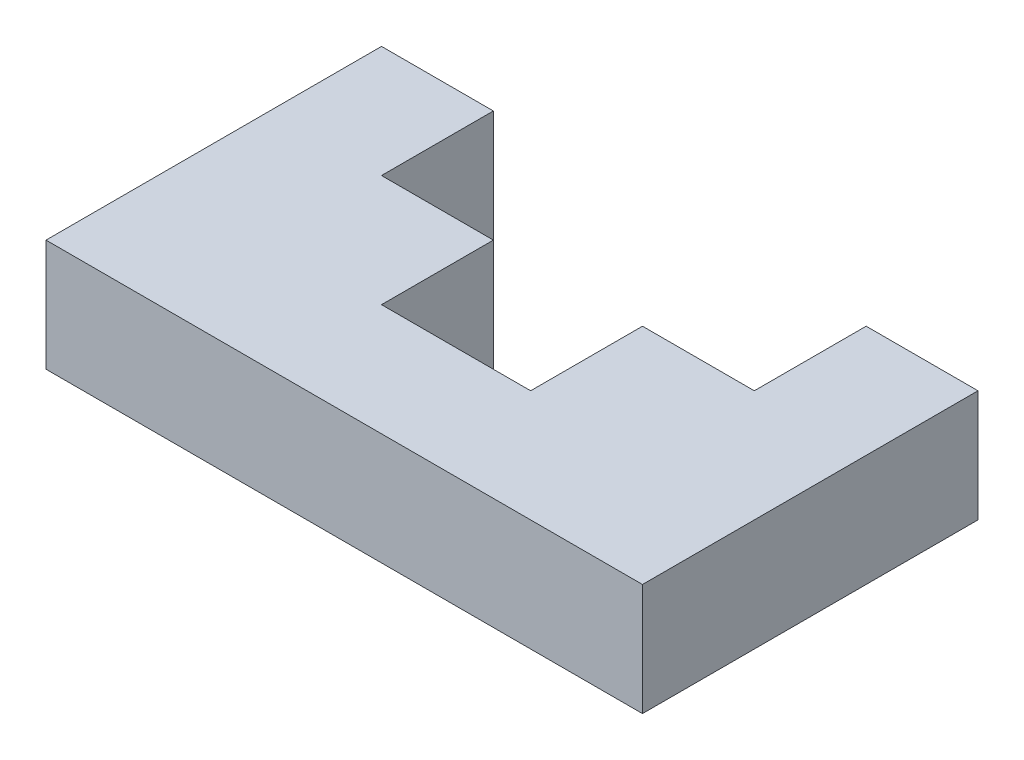
ISO-10303-21;
HEADER;
FILE_DESCRIPTION(('STEP AP214'),'2;1');
FILE_NAME('part.step','',(''),(''),'','','');
FILE_SCHEMA(('AUTOMOTIVE_DESIGN { 1 0 10303 214 1 1 1 1 }'));
ENDSEC;
DATA;
#1=APPLICATION_CONTEXT('core data for automotive mechanical design processes');
#2=APPLICATION_PROTOCOL_DEFINITION('international standard','automotive_design',2000,#1);
#3=PRODUCT_CONTEXT('',#1,'mechanical');
#4=PRODUCT('Part','Part','',(#3));
#5=PRODUCT_RELATED_PRODUCT_CATEGORY('part','',(#4));
#6=PRODUCT_DEFINITION_FORMATION('','',#4);
#7=PRODUCT_DEFINITION_CONTEXT('part definition',#1,'design');
#8=PRODUCT_DEFINITION('design','',#6,#7);
#9=PRODUCT_DEFINITION_SHAPE('','',#8);
#10=(LENGTH_UNIT() NAMED_UNIT(*) SI_UNIT(.MILLI.,.METRE.));
#11=(NAMED_UNIT(*) PLANE_ANGLE_UNIT() SI_UNIT($,.RADIAN.));
#12=(NAMED_UNIT(*) SI_UNIT($,.STERADIAN.) SOLID_ANGLE_UNIT());
#13=UNCERTAINTY_MEASURE_WITH_UNIT(LENGTH_MEASURE(1.E-05),#10,'distance_accuracy_value','');
#14=(GEOMETRIC_REPRESENTATION_CONTEXT(3) GLOBAL_UNCERTAINTY_ASSIGNED_CONTEXT((#13)) GLOBAL_UNIT_ASSIGNED_CONTEXT((#10,
#11,#12)) REPRESENTATION_CONTEXT('',''));
#15=CARTESIAN_POINT('',(0.,0.,0.));
#16=DIRECTION('',(0.,0.,1.));
#17=DIRECTION('',(1.,0.,0.));
#18=AXIS2_PLACEMENT_3D('',#15,#16,#17);
#19=CARTESIAN_POINT('',(5.,1.5,0.));
#20=DIRECTION('',(0.,0.,1.));
#21=DIRECTION('',(1.,0.,0.));
#22=AXIS2_PLACEMENT_3D('',#19,#20,#21);
#23=PLANE('',#22);
#24=DIRECTION('',(-1.,0.,0.));
#25=VECTOR('',#24,1.);
#26=CARTESIAN_POINT('',(5.,-1.5,0.));
#27=LINE('',#26,#25);
#28=CARTESIAN_POINT('',(8.,-1.5,0.));
#29=VERTEX_POINT('',#28);
#30=CARTESIAN_POINT('',(5.,-1.5,0.));
#31=VERTEX_POINT('',#30);
#32=EDGE_CURVE('E161',#29,#31,#27,.T.);
#33=ORIENTED_EDGE('',*,*,#32,.T.);
#34=DIRECTION('',(0.,-1.,0.));
#35=VECTOR('',#34,1.);
#36=CARTESIAN_POINT('',(5.,1.5,0.));
#37=LINE('',#36,#35);
#38=CARTESIAN_POINT('',(5.,1.5,0.));
#39=VERTEX_POINT('',#38);
#40=EDGE_CURVE('E11',#39,#31,#37,.T.);
#41=ORIENTED_EDGE('',*,*,#40,.F.);
#42=DIRECTION('',(-1.,0.,0.));
#43=VECTOR('',#42,1.);
#44=CARTESIAN_POINT('',(5.,1.5,0.));
#45=LINE('',#44,#43);
#46=CARTESIAN_POINT('',(8.,1.5,0.));
#47=VERTEX_POINT('',#46);
#48=EDGE_CURVE('E183',#47,#39,#45,.T.);
#49=ORIENTED_EDGE('',*,*,#48,.F.);
#50=DIRECTION('',(0.,-1.,0.));
#51=VECTOR('',#50,1.);
#52=CARTESIAN_POINT('',(8.,1.5,0.));
#53=LINE('',#52,#51);
#54=EDGE_CURVE('E157',#47,#29,#53,.T.);
#55=ORIENTED_EDGE('',*,*,#54,.T.);
#56=EDGE_LOOP('',(#33,#41,#49,#55));
#57=FACE_BOUND('',#56,.T.);
#58=ADVANCED_FACE('F41',(#57),#23,.F.);
#59=CARTESIAN_POINT('',(5.,1.5,3.));
#60=DIRECTION('',(1.,0.,0.));
#61=DIRECTION('',(0.,0.,-1.));
#62=AXIS2_PLACEMENT_3D('',#59,#60,#61);
#63=PLANE('',#62);
#64=DIRECTION('',(0.,0.,1.));
#65=VECTOR('',#64,1.);
#66=CARTESIAN_POINT('',(5.,-1.5,3.));
#67=LINE('',#66,#65);
#68=CARTESIAN_POINT('',(5.,-1.5,3.));
#69=VERTEX_POINT('',#68);
#70=EDGE_CURVE('E164',#31,#69,#67,.T.);
#71=ORIENTED_EDGE('',*,*,#70,.T.);
#72=DIRECTION('',(0.,-1.,0.));
#73=VECTOR('',#72,1.);
#74=CARTESIAN_POINT('',(5.,1.5,3.));
#75=LINE('',#74,#73);
#76=CARTESIAN_POINT('',(5.,1.5,3.));
#77=VERTEX_POINT('',#76);
#78=EDGE_CURVE('E49',#77,#69,#75,.T.);
#79=ORIENTED_EDGE('',*,*,#78,.F.);
#80=DIRECTION('',(0.,0.,1.));
#81=VECTOR('',#80,1.);
#82=CARTESIAN_POINT('',(5.,1.5,3.));
#83=LINE('',#82,#81);
#84=EDGE_CURVE('E112',#39,#77,#83,.T.);
#85=ORIENTED_EDGE('',*,*,#84,.F.);
#86=ORIENTED_EDGE('',*,*,#40,.T.);
#87=EDGE_LOOP('',(#71,#79,#85,#86));
#88=FACE_BOUND('',#87,.T.);
#89=ADVANCED_FACE('F261',(#88),#63,.F.);
#90=CARTESIAN_POINT('',(2.,1.5,3.));
#91=DIRECTION('',(0.,0.,1.));
#92=DIRECTION('',(1.,0.,0.));
#93=AXIS2_PLACEMENT_3D('',#90,#91,#92);
#94=PLANE('',#93);
#95=DIRECTION('',(-1.,0.,0.));
#96=VECTOR('',#95,1.);
#97=CARTESIAN_POINT('',(2.,-1.5,3.));
#98=LINE('',#97,#96);
#99=CARTESIAN_POINT('',(2.,-1.5,3.));
#100=VERTEX_POINT('',#99);
#101=EDGE_CURVE('E166',#69,#100,#98,.T.);
#102=ORIENTED_EDGE('',*,*,#101,.T.);
#103=DIRECTION('',(0.,-1.,0.));
#104=VECTOR('',#103,1.);
#105=CARTESIAN_POINT('',(2.,1.5,3.));
#106=LINE('',#105,#104);
#107=CARTESIAN_POINT('',(2.,1.5,3.));
#108=VERTEX_POINT('',#107);
#109=EDGE_CURVE('E202',#108,#100,#106,.T.);
#110=ORIENTED_EDGE('',*,*,#109,.F.);
#111=DIRECTION('',(-1.,0.,0.));
#112=VECTOR('',#111,1.);
#113=CARTESIAN_POINT('',(2.,1.5,3.));
#114=LINE('',#113,#112);
#115=EDGE_CURVE('E210',#77,#108,#114,.T.);
#116=ORIENTED_EDGE('',*,*,#115,.F.);
#117=ORIENTED_EDGE('',*,*,#78,.T.);
#118=EDGE_LOOP('',(#102,#110,#116,#117));
#119=FACE_BOUND('',#118,.T.);
#120=ADVANCED_FACE('F208',(#119),#94,.F.);
#121=CARTESIAN_POINT('',(2.,1.5,3.));
#122=DIRECTION('',(1.,0.,0.));
#123=DIRECTION('',(0.,0.,-1.));
#124=AXIS2_PLACEMENT_3D('',#121,#122,#123);
#125=PLANE('',#124);
#126=DIRECTION('',(0.,0.,1.));
#127=VECTOR('',#126,1.);
#128=CARTESIAN_POINT('',(2.,-1.5,3.));
#129=LINE('',#128,#127);
#130=CARTESIAN_POINT('',(2.,-1.5,6.));
#131=VERTEX_POINT('',#130);
#132=EDGE_CURVE('E168',#100,#131,#129,.T.);
#133=ORIENTED_EDGE('',*,*,#132,.T.);
#134=DIRECTION('',(0.,-1.,0.));
#135=VECTOR('',#134,1.);
#136=CARTESIAN_POINT('',(2.,1.5,6.));
#137=LINE('',#136,#135);
#138=CARTESIAN_POINT('',(2.,1.5,6.));
#139=VERTEX_POINT('',#138);
#140=EDGE_CURVE('E199',#139,#131,#137,.T.);
#141=ORIENTED_EDGE('',*,*,#140,.F.);
#142=DIRECTION('',(0.,0.,1.));
#143=VECTOR('',#142,1.);
#144=CARTESIAN_POINT('',(2.,1.5,3.));
#145=LINE('',#144,#143);
#146=EDGE_CURVE('E228',#108,#139,#145,.T.);
#147=ORIENTED_EDGE('',*,*,#146,.F.);
#148=ORIENTED_EDGE('',*,*,#109,.T.);
#149=EDGE_LOOP('',(#133,#141,#147,#148));
#150=FACE_BOUND('',#149,.T.);
#151=ADVANCED_FACE('F219',(#150),#125,.F.);
#152=CARTESIAN_POINT('',(-2.,1.5,6.));
#153=DIRECTION('',(0.,0.,1.));
#154=DIRECTION('',(1.,0.,0.));
#155=AXIS2_PLACEMENT_3D('',#152,#153,#154);
#156=PLANE('',#155);
#157=DIRECTION('',(-1.,0.,0.));
#158=VECTOR('',#157,1.);
#159=CARTESIAN_POINT('',(-2.,-1.5,6.));
#160=LINE('',#159,#158);
#161=CARTESIAN_POINT('',(-2.,-1.5,6.));
#162=VERTEX_POINT('',#161);
#163=EDGE_CURVE('E170',#131,#162,#160,.T.);
#164=ORIENTED_EDGE('',*,*,#163,.T.);
#165=DIRECTION('',(0.,-1.,0.));
#166=VECTOR('',#165,1.);
#167=CARTESIAN_POINT('',(-2.,1.5,6.));
#168=LINE('',#167,#166);
#169=CARTESIAN_POINT('',(-2.,1.5,6.));
#170=VERTEX_POINT('',#169);
#171=EDGE_CURVE('E196',#170,#162,#168,.T.);
#172=ORIENTED_EDGE('',*,*,#171,.F.);
#173=DIRECTION('',(-1.,0.,0.));
#174=VECTOR('',#173,1.);
#175=CARTESIAN_POINT('',(-2.,1.5,6.));
#176=LINE('',#175,#174);
#177=EDGE_CURVE('E225',#139,#170,#176,.T.);
#178=ORIENTED_EDGE('',*,*,#177,.F.);
#179=ORIENTED_EDGE('',*,*,#140,.T.);
#180=EDGE_LOOP('',(#164,#172,#178,#179));
#181=FACE_BOUND('',#180,.T.);
#182=ADVANCED_FACE('F223',(#181),#156,.F.);
#183=CARTESIAN_POINT('',(-2.,1.5,3.));
#184=DIRECTION('',(-1.,0.,0.));
#185=DIRECTION('',(0.,0.,1.));
#186=AXIS2_PLACEMENT_3D('',#183,#184,#185);
#187=PLANE('',#186);
#188=DIRECTION('',(0.,0.,-1.));
#189=VECTOR('',#188,1.);
#190=CARTESIAN_POINT('',(-2.,-1.5,3.));
#191=LINE('',#190,#189);
#192=CARTESIAN_POINT('',(-2.,-1.5,3.));
#193=VERTEX_POINT('',#192);
#194=EDGE_CURVE('E172',#162,#193,#191,.T.);
#195=ORIENTED_EDGE('',*,*,#194,.T.);
#196=DIRECTION('',(0.,-1.,0.));
#197=VECTOR('',#196,1.);
#198=CARTESIAN_POINT('',(-2.,1.5,3.));
#199=LINE('',#198,#197);
#200=CARTESIAN_POINT('',(-2.,1.5,3.));
#201=VERTEX_POINT('',#200);
#202=EDGE_CURVE('E193',#201,#193,#199,.T.);
#203=ORIENTED_EDGE('',*,*,#202,.F.);
#204=DIRECTION('',(0.,0.,-1.));
#205=VECTOR('',#204,1.);
#206=CARTESIAN_POINT('',(-2.,1.5,3.));
#207=LINE('',#206,#205);
#208=EDGE_CURVE('E227',#170,#201,#207,.T.);
#209=ORIENTED_EDGE('',*,*,#208,.F.);
#210=ORIENTED_EDGE('',*,*,#171,.T.);
#211=EDGE_LOOP('',(#195,#203,#209,#210));
#212=FACE_BOUND('',#211,.T.);
#213=ADVANCED_FACE('F274',(#212),#187,.F.);
#214=CARTESIAN_POINT('',(-2.,1.5,3.));
#215=DIRECTION('',(0.,0.,1.));
#216=DIRECTION('',(1.,0.,0.));
#217=AXIS2_PLACEMENT_3D('',#214,#215,#216);
#218=PLANE('',#217);
#219=DIRECTION('',(-1.,0.,0.));
#220=VECTOR('',#219,1.);
#221=CARTESIAN_POINT('',(-2.,-1.5,3.));
#222=LINE('',#221,#220);
#223=CARTESIAN_POINT('',(-5.,-1.5,3.));
#224=VERTEX_POINT('',#223);
#225=EDGE_CURVE('E174',#193,#224,#222,.T.);
#226=ORIENTED_EDGE('',*,*,#225,.T.);
#227=DIRECTION('',(0.,-1.,0.));
#228=VECTOR('',#227,1.);
#229=CARTESIAN_POINT('',(-5.,1.5,3.));
#230=LINE('',#229,#228);
#231=CARTESIAN_POINT('',(-5.,1.5,3.));
#232=VERTEX_POINT('',#231);
#233=EDGE_CURVE('E190',#232,#224,#230,.T.);
#234=ORIENTED_EDGE('',*,*,#233,.F.);
#235=DIRECTION('',(-1.,0.,0.));
#236=VECTOR('',#235,1.);
#237=CARTESIAN_POINT('',(-2.,1.5,3.));
#238=LINE('',#237,#236);
#239=EDGE_CURVE('E230',#201,#232,#238,.T.);
#240=ORIENTED_EDGE('',*,*,#239,.F.);
#241=ORIENTED_EDGE('',*,*,#202,.T.);
#242=EDGE_LOOP('',(#226,#234,#240,#241));
#243=FACE_BOUND('',#242,.T.);
#244=ADVANCED_FACE('F277',(#243),#218,.F.);
#245=CARTESIAN_POINT('',(-5.,1.5,3.));
#246=DIRECTION('',(-1.,0.,0.));
#247=DIRECTION('',(0.,0.,1.));
#248=AXIS2_PLACEMENT_3D('',#245,#246,#247);
#249=PLANE('',#248);
#250=DIRECTION('',(0.,0.,-1.));
#251=VECTOR('',#250,1.);
#252=CARTESIAN_POINT('',(-5.,-1.5,3.));
#253=LINE('',#252,#251);
#254=CARTESIAN_POINT('',(-5.,-1.5,0.));
#255=VERTEX_POINT('',#254);
#256=EDGE_CURVE('E176',#224,#255,#253,.T.);
#257=ORIENTED_EDGE('',*,*,#256,.T.);
#258=DIRECTION('',(0.,-1.,0.));
#259=VECTOR('',#258,1.);
#260=CARTESIAN_POINT('',(-5.,1.5,0.));
#261=LINE('',#260,#259);
#262=CARTESIAN_POINT('',(-5.,1.5,0.));
#263=VERTEX_POINT('',#262);
#264=EDGE_CURVE('E187',#263,#255,#261,.T.);
#265=ORIENTED_EDGE('',*,*,#264,.F.);
#266=DIRECTION('',(0.,0.,-1.));
#267=VECTOR('',#266,1.);
#268=CARTESIAN_POINT('',(-5.,1.5,3.));
#269=LINE('',#268,#267);
#270=EDGE_CURVE('E236',#232,#263,#269,.T.);
#271=ORIENTED_EDGE('',*,*,#270,.F.);
#272=ORIENTED_EDGE('',*,*,#233,.T.);
#273=EDGE_LOOP('',(#257,#265,#271,#272));
#274=FACE_BOUND('',#273,.T.);
#275=ADVANCED_FACE('F242',(#274),#249,.F.);
#276=CARTESIAN_POINT('',(-5.,1.5,0.));
#277=DIRECTION('',(0.,0.,1.));
#278=DIRECTION('',(1.,0.,0.));
#279=AXIS2_PLACEMENT_3D('',#276,#277,#278);
#280=PLANE('',#279);
#281=DIRECTION('',(-1.,0.,0.));
#282=VECTOR('',#281,1.);
#283=CARTESIAN_POINT('',(-5.,-1.5,0.));
#284=LINE('',#283,#282);
#285=CARTESIAN_POINT('',(-8.,-1.5,0.));
#286=VERTEX_POINT('',#285);
#287=EDGE_CURVE('E178',#255,#286,#284,.T.);
#288=ORIENTED_EDGE('',*,*,#287,.T.);
#289=DIRECTION('',(0.,-1.,0.));
#290=VECTOR('',#289,1.);
#291=CARTESIAN_POINT('',(-8.,1.5,0.));
#292=LINE('',#291,#290);
#293=CARTESIAN_POINT('',(-8.,1.5,0.));
#294=VERTEX_POINT('',#293);
#295=EDGE_CURVE('E152',#294,#286,#292,.T.);
#296=ORIENTED_EDGE('',*,*,#295,.F.);
#297=DIRECTION('',(-1.,0.,0.));
#298=VECTOR('',#297,1.);
#299=CARTESIAN_POINT('',(-5.,1.5,0.));
#300=LINE('',#299,#298);
#301=EDGE_CURVE('E143',#263,#294,#300,.T.);
#302=ORIENTED_EDGE('',*,*,#301,.F.);
#303=ORIENTED_EDGE('',*,*,#264,.T.);
#304=EDGE_LOOP('',(#288,#296,#302,#303));
#305=FACE_BOUND('',#304,.T.);
#306=ADVANCED_FACE('F246',(#305),#280,.F.);
#307=CARTESIAN_POINT('',(-8.,1.5,0.));
#308=DIRECTION('',(1.,0.,0.));
#309=DIRECTION('',(0.,0.,-1.));
#310=AXIS2_PLACEMENT_3D('',#307,#308,#309);
#311=PLANE('',#310);
#312=DIRECTION('',(0.,0.,1.));
#313=VECTOR('',#312,1.);
#314=CARTESIAN_POINT('',(-8.,-1.5,0.));
#315=LINE('',#314,#313);
#316=CARTESIAN_POINT('',(-8.,-1.5,9.));
#317=VERTEX_POINT('',#316);
#318=EDGE_CURVE('E151',#286,#317,#315,.T.);
#319=ORIENTED_EDGE('',*,*,#318,.T.);
#320=DIRECTION('',(0.,-1.,0.));
#321=VECTOR('',#320,1.);
#322=CARTESIAN_POINT('',(-8.,1.5,9.));
#323=LINE('',#322,#321);
#324=CARTESIAN_POINT('',(-8.,1.5,9.));
#325=VERTEX_POINT('',#324);
#326=EDGE_CURVE('E148',#325,#317,#323,.T.);
#327=ORIENTED_EDGE('',*,*,#326,.F.);
#328=DIRECTION('',(0.,0.,1.));
#329=VECTOR('',#328,1.);
#330=CARTESIAN_POINT('',(-8.,1.5,0.));
#331=LINE('',#330,#329);
#332=EDGE_CURVE('E137',#294,#325,#331,.T.);
#333=ORIENTED_EDGE('',*,*,#332,.F.);
#334=ORIENTED_EDGE('',*,*,#295,.T.);
#335=EDGE_LOOP('',(#319,#327,#333,#334));
#336=FACE_BOUND('',#335,.T.);
#337=ADVANCED_FACE('F149',(#336),#311,.F.);
#338=CARTESIAN_POINT('',(-8.,1.5,9.));
#339=DIRECTION('',(0.,0.,-1.));
#340=DIRECTION('',(-1.,0.,0.));
#341=AXIS2_PLACEMENT_3D('',#338,#339,#340);
#342=PLANE('',#341);
#343=DIRECTION('',(1.,0.,0.));
#344=VECTOR('',#343,1.);
#345=CARTESIAN_POINT('',(-8.,-1.5,9.));
#346=LINE('',#345,#344);
#347=CARTESIAN_POINT('',(8.,-1.5,9.));
#348=VERTEX_POINT('',#347);
#349=EDGE_CURVE('E98',#317,#348,#346,.T.);
#350=ORIENTED_EDGE('',*,*,#349,.T.);
#351=DIRECTION('',(0.,-1.,0.));
#352=VECTOR('',#351,1.);
#353=CARTESIAN_POINT('',(8.,1.5,9.));
#354=LINE('',#353,#352);
#355=CARTESIAN_POINT('',(8.,1.5,9.));
#356=VERTEX_POINT('',#355);
#357=EDGE_CURVE('E153',#356,#348,#354,.T.);
#358=ORIENTED_EDGE('',*,*,#357,.F.);
#359=DIRECTION('',(1.,0.,0.));
#360=VECTOR('',#359,1.);
#361=CARTESIAN_POINT('',(-8.,1.5,9.));
#362=LINE('',#361,#360);
#363=EDGE_CURVE('E141',#325,#356,#362,.T.);
#364=ORIENTED_EDGE('',*,*,#363,.F.);
#365=ORIENTED_EDGE('',*,*,#326,.T.);
#366=EDGE_LOOP('',(#350,#358,#364,#365));
#367=FACE_BOUND('',#366,.T.);
#368=ADVANCED_FACE('F155',(#367),#342,.F.);
#369=CARTESIAN_POINT('',(8.,1.5,0.));
#370=DIRECTION('',(-1.,0.,0.));
#371=DIRECTION('',(0.,0.,1.));
#372=AXIS2_PLACEMENT_3D('',#369,#370,#371);
#373=PLANE('',#372);
#374=DIRECTION('',(0.,0.,-1.));
#375=VECTOR('',#374,1.);
#376=CARTESIAN_POINT('',(8.,-1.5,0.));
#377=LINE('',#376,#375);
#378=EDGE_CURVE('E104',#348,#29,#377,.T.);
#379=ORIENTED_EDGE('',*,*,#378,.T.);
#380=ORIENTED_EDGE('',*,*,#54,.F.);
#381=DIRECTION('',(0.,0.,-1.));
#382=VECTOR('',#381,1.);
#383=CARTESIAN_POINT('',(8.,1.5,0.));
#384=LINE('',#383,#382);
#385=EDGE_CURVE('E57',#356,#47,#384,.T.);
#386=ORIENTED_EDGE('',*,*,#385,.F.);
#387=ORIENTED_EDGE('',*,*,#357,.T.);
#388=EDGE_LOOP('',(#379,#380,#386,#387));
#389=FACE_BOUND('',#388,.T.);
#390=ADVANCED_FACE('F250',(#389),#373,.F.);
#391=CARTESIAN_POINT('',(0.,1.5,0.));
#392=DIRECTION('',(0.,-1.,0.));
#393=DIRECTION('',(0.,0.,-1.));
#394=AXIS2_PLACEMENT_3D('',#391,#392,#393);
#395=PLANE('',#394);
#396=ORIENTED_EDGE('',*,*,#48,.T.);
#397=ORIENTED_EDGE('',*,*,#84,.T.);
#398=ORIENTED_EDGE('',*,*,#115,.T.);
#399=ORIENTED_EDGE('',*,*,#146,.T.);
#400=ORIENTED_EDGE('',*,*,#177,.T.);
#401=ORIENTED_EDGE('',*,*,#208,.T.);
#402=ORIENTED_EDGE('',*,*,#239,.T.);
#403=ORIENTED_EDGE('',*,*,#270,.T.);
#404=ORIENTED_EDGE('',*,*,#301,.T.);
#405=ORIENTED_EDGE('',*,*,#332,.T.);
#406=ORIENTED_EDGE('',*,*,#363,.T.);
#407=ORIENTED_EDGE('',*,*,#385,.T.);
#408=EDGE_LOOP('',(#396,#397,#398,#399,#400,#401,#402,#403,#404,#405,#406,#407));
#409=FACE_BOUND('',#408,.T.);
#410=ADVANCED_FACE('F139',(#409),#395,.F.);
#411=CARTESIAN_POINT('',(0.,-1.5,0.));
#412=DIRECTION('',(0.,-1.,0.));
#413=DIRECTION('',(0.,0.,-1.));
#414=AXIS2_PLACEMENT_3D('',#411,#412,#413);
#415=PLANE('',#414);
#416=ORIENTED_EDGE('',*,*,#32,.F.);
#417=ORIENTED_EDGE('',*,*,#378,.F.);
#418=ORIENTED_EDGE('',*,*,#349,.F.);
#419=ORIENTED_EDGE('',*,*,#318,.F.);
#420=ORIENTED_EDGE('',*,*,#287,.F.);
#421=ORIENTED_EDGE('',*,*,#256,.F.);
#422=ORIENTED_EDGE('',*,*,#225,.F.);
#423=ORIENTED_EDGE('',*,*,#194,.F.);
#424=ORIENTED_EDGE('',*,*,#163,.F.);
#425=ORIENTED_EDGE('',*,*,#132,.F.);
#426=ORIENTED_EDGE('',*,*,#101,.F.);
#427=ORIENTED_EDGE('',*,*,#70,.F.);
#428=EDGE_LOOP('',(#416,#417,#418,#419,#420,#421,#422,#423,#424,#425,#426,#427));
#429=FACE_BOUND('',#428,.T.);
#430=ADVANCED_FACE('F214',(#429),#415,.T.);
#431=CLOSED_SHELL('',(#58,#89,#120,#151,#182,#213,#244,#275,#306,#337,#368,#390,#410,#430));
#432=MANIFOLD_SOLID_BREP('B2',#431);
#433=ADVANCED_BREP_SHAPE_REPRESENTATION('',(#18,#432),#14);
#434=SHAPE_DEFINITION_REPRESENTATION(#9,#433);
ENDSEC;
END-ISO-10303-21;
